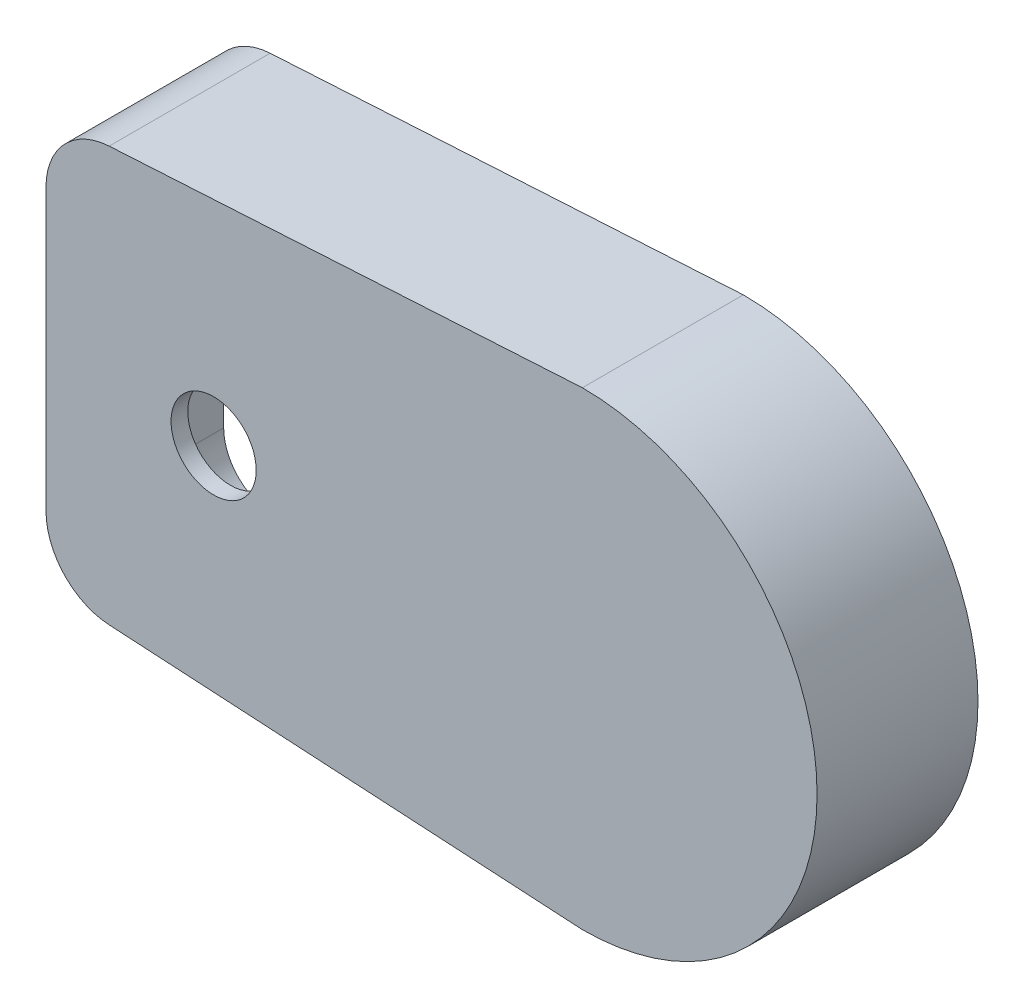
ISO-10303-21;
HEADER;
FILE_DESCRIPTION(('STEP AP214'),'2;1');
FILE_NAME('part.step','',(''),(''),'','','');
FILE_SCHEMA(('AUTOMOTIVE_DESIGN { 1 0 10303 214 1 1 1 1 }'));
ENDSEC;
DATA;
#1=APPLICATION_CONTEXT('core data for automotive mechanical design processes');
#2=APPLICATION_PROTOCOL_DEFINITION('international standard','automotive_design',2000,#1);
#3=PRODUCT_CONTEXT('',#1,'mechanical');
#4=PRODUCT('Part','Part','',(#3));
#5=PRODUCT_RELATED_PRODUCT_CATEGORY('part','',(#4));
#6=PRODUCT_DEFINITION_FORMATION('','',#4);
#7=PRODUCT_DEFINITION_CONTEXT('part definition',#1,'design');
#8=PRODUCT_DEFINITION('design','',#6,#7);
#9=PRODUCT_DEFINITION_SHAPE('','',#8);
#10=(LENGTH_UNIT() NAMED_UNIT(*) SI_UNIT(.MILLI.,.METRE.));
#11=(NAMED_UNIT(*) PLANE_ANGLE_UNIT() SI_UNIT($,.RADIAN.));
#12=(NAMED_UNIT(*) SI_UNIT($,.STERADIAN.) SOLID_ANGLE_UNIT());
#13=UNCERTAINTY_MEASURE_WITH_UNIT(LENGTH_MEASURE(1.E-05),#10,'distance_accuracy_value','');
#14=(GEOMETRIC_REPRESENTATION_CONTEXT(3) GLOBAL_UNCERTAINTY_ASSIGNED_CONTEXT((#13)) GLOBAL_UNIT_ASSIGNED_CONTEXT((#10,
#11,#12)) REPRESENTATION_CONTEXT('',''));
#15=CARTESIAN_POINT('',(0.,0.,0.));
#16=DIRECTION('',(0.,0.,1.));
#17=DIRECTION('',(1.,0.,0.));
#18=AXIS2_PLACEMENT_3D('',#15,#16,#17);
#19=CARTESIAN_POINT('',(20.,41.8728550290396,24.));
#20=DIRECTION('',(0.,0.,-1.));
#21=DIRECTION('',(-1.,0.,0.));
#22=AXIS2_PLACEMENT_3D('',#19,#20,#21);
#23=CYLINDRICAL_SURFACE('',#22,20.);
#24=CARTESIAN_POINT('',(20.,41.8728550290396,-24.));
#25=DIRECTION('',(0.,0.,1.));
#26=DIRECTION('',(1.,0.,0.));
#27=AXIS2_PLACEMENT_3D('',#24,#25,#26);
#28=CIRCLE('',#27,20.);
#29=CARTESIAN_POINT('',(18.8456774284378,61.8395157263316,-24.));
#30=VERTEX_POINT('',#29);
#31=CARTESIAN_POINT('',(0.,41.8728550290396,-24.));
#32=VERTEX_POINT('',#31);
#33=EDGE_CURVE('E139',#30,#32,#28,.T.);
#34=ORIENTED_EDGE('',*,*,#33,.T.);
#35=DIRECTION('',(0.,0.,-1.));
#36=VECTOR('',#35,1.);
#37=CARTESIAN_POINT('',(0.,41.8728550290396,24.));
#38=LINE('',#37,#36);
#39=CARTESIAN_POINT('',(0.,41.8728550290396,24.));
#40=VERTEX_POINT('',#39);
#41=EDGE_CURVE('E11',#40,#32,#38,.T.);
#42=ORIENTED_EDGE('',*,*,#41,.F.);
#43=CARTESIAN_POINT('',(20.,41.8728550290396,24.));
#44=DIRECTION('',(0.,0.,1.));
#45=DIRECTION('',(1.,0.,0.));
#46=AXIS2_PLACEMENT_3D('',#43,#44,#45);
#47=CIRCLE('',#46,20.);
#48=CARTESIAN_POINT('',(18.8456774284378,61.8395157263316,24.));
#49=VERTEX_POINT('',#48);
#50=EDGE_CURVE('E154',#49,#40,#47,.T.);
#51=ORIENTED_EDGE('',*,*,#50,.F.);
#52=DIRECTION('',(0.,0.,-1.));
#53=VECTOR('',#52,1.);
#54=CARTESIAN_POINT('',(18.8456774284378,61.8395157263316,24.));
#55=LINE('',#54,#53);
#56=EDGE_CURVE('E65',#49,#30,#55,.T.);
#57=ORIENTED_EDGE('',*,*,#56,.T.);
#58=EDGE_LOOP('',(#34,#42,#51,#57));
#59=FACE_BOUND('',#58,.T.);
#60=ADVANCED_FACE('F41',(#59),#23,.T.);
#61=CARTESIAN_POINT('',(0.,41.8728550290396,24.));
#62=DIRECTION('',(1.,0.,0.));
#63=DIRECTION('',(0.,1.,0.));
#64=AXIS2_PLACEMENT_3D('',#61,#62,#63);
#65=PLANE('',#64);
#66=DIRECTION('',(0.,-1.,0.));
#67=VECTOR('',#66,1.);
#68=CARTESIAN_POINT('',(0.,41.8728550290396,-24.));
#69=LINE('',#68,#67);
#70=CARTESIAN_POINT('',(0.,-41.8728550290396,-24.));
#71=VERTEX_POINT('',#70);
#72=EDGE_CURVE('E141',#32,#71,#69,.T.);
#73=ORIENTED_EDGE('',*,*,#72,.T.);
#74=DIRECTION('',(0.,0.,-1.));
#75=VECTOR('',#74,1.);
#76=CARTESIAN_POINT('',(0.,-41.8728550290396,24.));
#77=LINE('',#76,#75);
#78=CARTESIAN_POINT('',(0.,-41.8728550290396,24.));
#79=VERTEX_POINT('',#78);
#80=EDGE_CURVE('E49',#79,#71,#77,.T.);
#81=ORIENTED_EDGE('',*,*,#80,.F.);
#82=DIRECTION('',(0.,-1.,0.));
#83=VECTOR('',#82,1.);
#84=CARTESIAN_POINT('',(0.,41.8728550290396,24.));
#85=LINE('',#84,#83);
#86=EDGE_CURVE('E98',#40,#79,#85,.T.);
#87=ORIENTED_EDGE('',*,*,#86,.F.);
#88=ORIENTED_EDGE('',*,*,#41,.T.);
#89=EDGE_LOOP('',(#73,#81,#87,#88));
#90=FACE_BOUND('',#89,.T.);
#91=ADVANCED_FACE('F161',(#90),#65,.F.);
#92=CARTESIAN_POINT('',(20.,-41.8728550290396,24.));
#93=DIRECTION('',(0.,0.,-1.));
#94=DIRECTION('',(-1.,0.,0.));
#95=AXIS2_PLACEMENT_3D('',#92,#93,#94);
#96=CYLINDRICAL_SURFACE('',#95,20.);
#97=CARTESIAN_POINT('',(20.,-41.8728550290396,-24.));
#98=DIRECTION('',(0.,0.,-1.));
#99=DIRECTION('',(-1.,0.,0.));
#100=AXIS2_PLACEMENT_3D('',#97,#98,#99);
#101=CIRCLE('',#100,20.);
#102=CARTESIAN_POINT('',(18.8456774284378,-61.8395157263316,-24.));
#103=VERTEX_POINT('',#102);
#104=EDGE_CURVE('E145',#103,#71,#101,.T.);
#105=ORIENTED_EDGE('',*,*,#104,.F.);
#106=DIRECTION('',(0.,0.,-1.));
#107=VECTOR('',#106,1.);
#108=CARTESIAN_POINT('',(18.8456774284378,-61.8395157263316,24.));
#109=LINE('',#108,#107);
#110=CARTESIAN_POINT('',(18.8456774284378,-61.8395157263316,24.));
#111=VERTEX_POINT('',#110);
#112=EDGE_CURVE('E130',#111,#103,#109,.T.);
#113=ORIENTED_EDGE('',*,*,#112,.F.);
#114=CARTESIAN_POINT('',(20.,-41.8728550290396,24.));
#115=DIRECTION('',(0.,0.,-1.));
#116=DIRECTION('',(-1.,0.,0.));
#117=AXIS2_PLACEMENT_3D('',#114,#115,#116);
#118=CIRCLE('',#117,20.);
#119=EDGE_CURVE('E119',#111,#79,#118,.T.);
#120=ORIENTED_EDGE('',*,*,#119,.T.);
#121=ORIENTED_EDGE('',*,*,#80,.T.);
#122=EDGE_LOOP('',(#105,#113,#120,#121));
#123=FACE_BOUND('',#122,.T.);
#124=ADVANCED_FACE('F160',(#123),#96,.T.);
#125=CARTESIAN_POINT('',(18.8456774284378,-61.8395157263316,24.));
#126=DIRECTION('',(0.0577161285781096,0.998333034864596,0.));
#127=DIRECTION('',(-0.998333034864596,0.0577161285781096,0.));
#128=AXIS2_PLACEMENT_3D('',#125,#126,#127);
#129=PLANE('',#128);
#130=DIRECTION('',(0.998333034864596,-0.0577161285781096,0.));
#131=VECTOR('',#130,1.);
#132=CARTESIAN_POINT('',(18.8456774284378,-61.8395157263316,-24.));
#133=LINE('',#132,#131);
#134=CARTESIAN_POINT('',(160.,-70.,-24.));
#135=VERTEX_POINT('',#134);
#136=EDGE_CURVE('E126',#103,#135,#133,.T.);
#137=ORIENTED_EDGE('',*,*,#136,.T.);
#138=DIRECTION('',(0.,0.,-1.));
#139=VECTOR('',#138,1.);
#140=CARTESIAN_POINT('',(160.,-70.,24.));
#141=LINE('',#140,#139);
#142=CARTESIAN_POINT('',(160.,-70.,24.));
#143=VERTEX_POINT('',#142);
#144=EDGE_CURVE('E123',#143,#135,#141,.T.);
#145=ORIENTED_EDGE('',*,*,#144,.F.);
#146=DIRECTION('',(0.998333034864596,-0.0577161285781096,0.));
#147=VECTOR('',#146,1.);
#148=CARTESIAN_POINT('',(18.8456774284378,-61.8395157263316,24.));
#149=LINE('',#148,#147);
#150=EDGE_CURVE('E111',#111,#143,#149,.T.);
#151=ORIENTED_EDGE('',*,*,#150,.F.);
#152=ORIENTED_EDGE('',*,*,#112,.T.);
#153=EDGE_LOOP('',(#137,#145,#151,#152));
#154=FACE_BOUND('',#153,.T.);
#155=ADVANCED_FACE('F124',(#154),#129,.F.);
#156=CARTESIAN_POINT('',(160.,0.,24.));
#157=DIRECTION('',(0.,0.,-1.));
#158=DIRECTION('',(-1.,0.,0.));
#159=AXIS2_PLACEMENT_3D('',#156,#157,#158);
#160=CYLINDRICAL_SURFACE('',#159,70.);
#161=CARTESIAN_POINT('',(160.,0.,-24.));
#162=DIRECTION('',(0.,0.,1.));
#163=DIRECTION('',(1.,0.,0.));
#164=AXIS2_PLACEMENT_3D('',#161,#162,#163);
#165=CIRCLE('',#164,70.);
#166=CARTESIAN_POINT('',(160.,70.,-24.));
#167=VERTEX_POINT('',#166);
#168=EDGE_CURVE('E149',#135,#167,#165,.T.);
#169=ORIENTED_EDGE('',*,*,#168,.T.);
#170=DIRECTION('',(0.,0.,-1.));
#171=VECTOR('',#170,1.);
#172=CARTESIAN_POINT('',(160.,70.,24.));
#173=LINE('',#172,#171);
#174=CARTESIAN_POINT('',(160.,70.,24.));
#175=VERTEX_POINT('',#174);
#176=EDGE_CURVE('E131',#175,#167,#173,.T.);
#177=ORIENTED_EDGE('',*,*,#176,.F.);
#178=CARTESIAN_POINT('',(160.,0.,24.));
#179=DIRECTION('',(0.,0.,1.));
#180=DIRECTION('',(1.,0.,0.));
#181=AXIS2_PLACEMENT_3D('',#178,#179,#180);
#182=CIRCLE('',#181,70.);
#183=EDGE_CURVE('E116',#143,#175,#182,.T.);
#184=ORIENTED_EDGE('',*,*,#183,.F.);
#185=ORIENTED_EDGE('',*,*,#144,.T.);
#186=EDGE_LOOP('',(#169,#177,#184,#185));
#187=FACE_BOUND('',#186,.T.);
#188=ADVANCED_FACE('F133',(#187),#160,.T.);
#189=CARTESIAN_POINT('',(18.8456774284378,61.8395157263316,24.));
#190=DIRECTION('',(-0.0577161285781096,0.998333034864596,0.));
#191=DIRECTION('',(-0.998333034864596,-0.0577161285781096,0.));
#192=AXIS2_PLACEMENT_3D('',#189,#190,#191);
#193=PLANE('',#192);
#194=DIRECTION('',(0.998333034864596,0.0577161285781096,0.));
#195=VECTOR('',#194,1.);
#196=CARTESIAN_POINT('',(18.8456774284378,61.8395157263316,-24.));
#197=LINE('',#196,#195);
#198=EDGE_CURVE('E151',#30,#167,#197,.T.);
#199=ORIENTED_EDGE('',*,*,#198,.F.);
#200=ORIENTED_EDGE('',*,*,#56,.F.);
#201=DIRECTION('',(0.998333034864596,0.0577161285781096,0.));
#202=VECTOR('',#201,1.);
#203=CARTESIAN_POINT('',(18.8456774284378,61.8395157263316,24.));
#204=LINE('',#203,#202);
#205=EDGE_CURVE('E134',#49,#175,#204,.T.);
#206=ORIENTED_EDGE('',*,*,#205,.T.);
#207=ORIENTED_EDGE('',*,*,#176,.T.);
#208=EDGE_LOOP('',(#199,#200,#206,#207));
#209=FACE_BOUND('',#208,.T.);
#210=ADVANCED_FACE('F165',(#209),#193,.T.);
#211=CARTESIAN_POINT('',(20.,41.8728550290396,24.));
#212=DIRECTION('',(0.,0.,1.));
#213=DIRECTION('',(1.,0.,0.));
#214=AXIS2_PLACEMENT_3D('',#211,#212,#213);
#215=PLANE('',#214);
#216=CARTESIAN_POINT('',(50.,0.,24.));
#217=DIRECTION('',(0.,0.,1.));
#218=DIRECTION('',(1.,0.,0.));
#219=AXIS2_PLACEMENT_3D('',#216,#217,#218);
#220=CIRCLE('',#219,12.7);
#221=CARTESIAN_POINT('',(62.7,0.,24.));
#222=VERTEX_POINT('',#221);
#223=EDGE_CURVE('E225',#222,#222,#220,.T.);
#224=ORIENTED_EDGE('',*,*,#223,.F.);
#225=EDGE_LOOP('',(#224));
#226=FACE_BOUND('',#225,.T.);
#227=ORIENTED_EDGE('',*,*,#50,.T.);
#228=ORIENTED_EDGE('',*,*,#86,.T.);
#229=ORIENTED_EDGE('',*,*,#119,.F.);
#230=ORIENTED_EDGE('',*,*,#150,.T.);
#231=ORIENTED_EDGE('',*,*,#183,.T.);
#232=ORIENTED_EDGE('',*,*,#205,.F.);
#233=EDGE_LOOP('',(#227,#228,#229,#230,#231,#232));
#234=FACE_BOUND('',#233,.T.);
#235=ADVANCED_FACE('F113',(#226,#234),#215,.T.);
#236=CARTESIAN_POINT('',(20.,41.8728550290396,-24.));
#237=DIRECTION('',(0.,0.,1.));
#238=DIRECTION('',(1.,0.,0.));
#239=AXIS2_PLACEMENT_3D('',#236,#237,#238);
#240=PLANE('',#239);
#241=DIRECTION('',(0.998333034864596,0.0577161285781096,0.));
#242=VECTOR('',#241,1.);
#243=CARTESIAN_POINT('',(19.1342580713284,56.8478505520086,-24.));
#244=LINE('',#243,#242);
#245=CARTESIAN_POINT('',(19.1342580713284,56.8478505520086,-24.));
#246=VERTEX_POINT('',#245);
#247=CARTESIAN_POINT('',(160.141737642964,64.9998454647438,-24.));
#248=VERTEX_POINT('',#247);
#249=EDGE_CURVE('E249',#246,#248,#244,.T.);
#250=ORIENTED_EDGE('',*,*,#249,.F.);
#251=CARTESIAN_POINT('',(20.,41.8728550290396,-24.));
#252=DIRECTION('',(0.,0.,-1.));
#253=DIRECTION('',(-1.,0.,0.));
#254=AXIS2_PLACEMENT_3D('',#251,#252,#253);
#255=CIRCLE('',#254,15.);
#256=CARTESIAN_POINT('',(5.,41.8728550290396,-24.));
#257=VERTEX_POINT('',#256);
#258=EDGE_CURVE('E56',#257,#246,#255,.T.);
#259=ORIENTED_EDGE('',*,*,#258,.F.);
#260=DIRECTION('',(0.,1.,0.));
#261=VECTOR('',#260,1.);
#262=CARTESIAN_POINT('',(5.00000000000001,-41.8728550290396,-24.));
#263=LINE('',#262,#261);
#264=CARTESIAN_POINT('',(5.00000000000001,-41.8728550290396,-24.));
#265=VERTEX_POINT('',#264);
#266=EDGE_CURVE('E232',#265,#257,#263,.T.);
#267=ORIENTED_EDGE('',*,*,#266,.F.);
#268=CARTESIAN_POINT('',(20.,-41.8728550290396,-24.));
#269=DIRECTION('',(0.,0.,-1.));
#270=DIRECTION('',(-1.,0.,0.));
#271=AXIS2_PLACEMENT_3D('',#268,#269,#270);
#272=CIRCLE('',#271,15.);
#273=CARTESIAN_POINT('',(19.1342580713284,-56.8478505520086,-24.));
#274=VERTEX_POINT('',#273);
#275=EDGE_CURVE('E258',#274,#265,#272,.T.);
#276=ORIENTED_EDGE('',*,*,#275,.F.);
#277=DIRECTION('',(-0.998333034864596,0.0577161285781096,0.));
#278=VECTOR('',#277,1.);
#279=CARTESIAN_POINT('',(160.141737642964,-64.9998454647438,-24.));
#280=LINE('',#279,#278);
#281=CARTESIAN_POINT('',(160.141737642964,-64.9998454647438,-24.));
#282=VERTEX_POINT('',#281);
#283=EDGE_CURVE('E255',#282,#274,#280,.T.);
#284=ORIENTED_EDGE('',*,*,#283,.F.);
#285=CARTESIAN_POINT('',(160.,0.,-24.));
#286=DIRECTION('',(0.,0.,-1.));
#287=DIRECTION('',(-1.,0.,0.));
#288=AXIS2_PLACEMENT_3D('',#285,#286,#287);
#289=CIRCLE('',#288,65.);
#290=EDGE_CURVE('E252',#248,#282,#289,.T.);
#291=ORIENTED_EDGE('',*,*,#290,.F.);
#292=EDGE_LOOP('',(#250,#259,#267,#276,#284,#291));
#293=FACE_BOUND('',#292,.T.);
#294=ORIENTED_EDGE('',*,*,#33,.F.);
#295=ORIENTED_EDGE('',*,*,#198,.T.);
#296=ORIENTED_EDGE('',*,*,#168,.F.);
#297=ORIENTED_EDGE('',*,*,#136,.F.);
#298=ORIENTED_EDGE('',*,*,#104,.T.);
#299=ORIENTED_EDGE('',*,*,#72,.F.);
#300=EDGE_LOOP('',(#294,#295,#296,#297,#298,#299));
#301=FACE_BOUND('',#300,.T.);
#302=ADVANCED_FACE('F164',(#293,#301),#240,.F.);
#303=CARTESIAN_POINT('',(20.,41.8728550290396,19.));
#304=DIRECTION('',(0.,0.,-1.));
#305=DIRECTION('',(-1.,0.,0.));
#306=AXIS2_PLACEMENT_3D('',#303,#304,#305);
#307=CYLINDRICAL_SURFACE('',#306,15.);
#308=ORIENTED_EDGE('',*,*,#258,.T.);
#309=DIRECTION('',(0.,0.,-1.));
#310=VECTOR('',#309,1.);
#311=CARTESIAN_POINT('',(19.1342580713284,56.8478505520086,19.));
#312=LINE('',#311,#310);
#313=CARTESIAN_POINT('',(19.1342580713284,56.8478505520086,19.));
#314=VERTEX_POINT('',#313);
#315=EDGE_CURVE('E247',#314,#246,#312,.T.);
#316=ORIENTED_EDGE('',*,*,#315,.F.);
#317=CARTESIAN_POINT('',(20.,41.8728550290396,19.));
#318=DIRECTION('',(0.,0.,-1.));
#319=DIRECTION('',(-1.,0.,0.));
#320=AXIS2_PLACEMENT_3D('',#317,#318,#319);
#321=CIRCLE('',#320,15.);
#322=CARTESIAN_POINT('',(5.,41.8728550290396,19.));
#323=VERTEX_POINT('',#322);
#324=EDGE_CURVE('E228',#323,#314,#321,.T.);
#325=ORIENTED_EDGE('',*,*,#324,.F.);
#326=DIRECTION('',(0.,0.,-1.));
#327=VECTOR('',#326,1.);
#328=CARTESIAN_POINT('',(5.,41.8728550290396,19.));
#329=LINE('',#328,#327);
#330=EDGE_CURVE('E142',#323,#257,#329,.T.);
#331=ORIENTED_EDGE('',*,*,#330,.T.);
#332=EDGE_LOOP('',(#308,#316,#325,#331));
#333=FACE_BOUND('',#332,.T.);
#334=ADVANCED_FACE('F184',(#333),#307,.F.);
#335=CARTESIAN_POINT('',(5.00000000000001,-41.8728550290396,19.));
#336=DIRECTION('',(-1.,0.,0.));
#337=DIRECTION('',(0.,-1.,0.));
#338=AXIS2_PLACEMENT_3D('',#335,#336,#337);
#339=PLANE('',#338);
#340=ORIENTED_EDGE('',*,*,#266,.T.);
#341=ORIENTED_EDGE('',*,*,#330,.F.);
#342=DIRECTION('',(0.,1.,0.));
#343=VECTOR('',#342,1.);
#344=CARTESIAN_POINT('',(5.00000000000001,-41.8728550290396,19.));
#345=LINE('',#344,#343);
#346=CARTESIAN_POINT('',(5.00000000000001,-41.8728550290396,19.));
#347=VERTEX_POINT('',#346);
#348=EDGE_CURVE('E244',#347,#323,#345,.T.);
#349=ORIENTED_EDGE('',*,*,#348,.F.);
#350=DIRECTION('',(0.,0.,-1.));
#351=VECTOR('',#350,1.);
#352=CARTESIAN_POINT('',(5.00000000000001,-41.8728550290396,19.));
#353=LINE('',#352,#351);
#354=EDGE_CURVE('E264',#347,#265,#353,.T.);
#355=ORIENTED_EDGE('',*,*,#354,.T.);
#356=EDGE_LOOP('',(#340,#341,#349,#355));
#357=FACE_BOUND('',#356,.T.);
#358=ADVANCED_FACE('F191',(#357),#339,.F.);
#359=CARTESIAN_POINT('',(20.,-41.8728550290396,19.));
#360=DIRECTION('',(0.,0.,-1.));
#361=DIRECTION('',(-1.,0.,0.));
#362=AXIS2_PLACEMENT_3D('',#359,#360,#361);
#363=CYLINDRICAL_SURFACE('',#362,15.);
#364=ORIENTED_EDGE('',*,*,#275,.T.);
#365=ORIENTED_EDGE('',*,*,#354,.F.);
#366=CARTESIAN_POINT('',(20.,-41.8728550290396,19.));
#367=DIRECTION('',(0.,0.,-1.));
#368=DIRECTION('',(-1.,0.,0.));
#369=AXIS2_PLACEMENT_3D('',#366,#367,#368);
#370=CIRCLE('',#369,15.);
#371=CARTESIAN_POINT('',(19.1342580713284,-56.8478505520086,19.));
#372=VERTEX_POINT('',#371);
#373=EDGE_CURVE('E241',#372,#347,#370,.T.);
#374=ORIENTED_EDGE('',*,*,#373,.F.);
#375=DIRECTION('',(0.,0.,-1.));
#376=VECTOR('',#375,1.);
#377=CARTESIAN_POINT('',(19.1342580713284,-56.8478505520086,19.));
#378=LINE('',#377,#376);
#379=EDGE_CURVE('E267',#372,#274,#378,.T.);
#380=ORIENTED_EDGE('',*,*,#379,.T.);
#381=EDGE_LOOP('',(#364,#365,#374,#380));
#382=FACE_BOUND('',#381,.T.);
#383=ADVANCED_FACE('F204',(#382),#363,.F.);
#384=CARTESIAN_POINT('',(160.141737642964,-64.9998454647438,19.));
#385=DIRECTION('',(-0.0577161285781096,-0.998333034864596,0.));
#386=DIRECTION('',(0.998333034864596,-0.0577161285781096,0.));
#387=AXIS2_PLACEMENT_3D('',#384,#385,#386);
#388=PLANE('',#387);
#389=ORIENTED_EDGE('',*,*,#283,.T.);
#390=ORIENTED_EDGE('',*,*,#379,.F.);
#391=DIRECTION('',(-0.998333034864596,0.0577161285781096,0.));
#392=VECTOR('',#391,1.);
#393=CARTESIAN_POINT('',(160.141737642964,-64.9998454647438,19.));
#394=LINE('',#393,#392);
#395=CARTESIAN_POINT('',(160.141737642964,-64.9998454647438,19.));
#396=VERTEX_POINT('',#395);
#397=EDGE_CURVE('E238',#396,#372,#394,.T.);
#398=ORIENTED_EDGE('',*,*,#397,.F.);
#399=DIRECTION('',(0.,0.,-1.));
#400=VECTOR('',#399,1.);
#401=CARTESIAN_POINT('',(160.141737642964,-64.9998454647438,19.));
#402=LINE('',#401,#400);
#403=EDGE_CURVE('E270',#396,#282,#402,.T.);
#404=ORIENTED_EDGE('',*,*,#403,.T.);
#405=EDGE_LOOP('',(#389,#390,#398,#404));
#406=FACE_BOUND('',#405,.T.);
#407=ADVANCED_FACE('F200',(#406),#388,.F.);
#408=CARTESIAN_POINT('',(160.,0.,19.));
#409=DIRECTION('',(0.,0.,-1.));
#410=DIRECTION('',(-1.,0.,0.));
#411=AXIS2_PLACEMENT_3D('',#408,#409,#410);
#412=CYLINDRICAL_SURFACE('',#411,65.);
#413=ORIENTED_EDGE('',*,*,#290,.T.);
#414=ORIENTED_EDGE('',*,*,#403,.F.);
#415=CARTESIAN_POINT('',(160.,0.,19.));
#416=DIRECTION('',(0.,0.,-1.));
#417=DIRECTION('',(-1.,0.,0.));
#418=AXIS2_PLACEMENT_3D('',#415,#416,#417);
#419=CIRCLE('',#418,65.);
#420=CARTESIAN_POINT('',(160.141737642964,64.9998454647438,19.));
#421=VERTEX_POINT('',#420);
#422=EDGE_CURVE('E235',#421,#396,#419,.T.);
#423=ORIENTED_EDGE('',*,*,#422,.F.);
#424=DIRECTION('',(0.,0.,-1.));
#425=VECTOR('',#424,1.);
#426=CARTESIAN_POINT('',(160.141737642964,64.9998454647438,19.));
#427=LINE('',#426,#425);
#428=EDGE_CURVE('E273',#421,#248,#427,.T.);
#429=ORIENTED_EDGE('',*,*,#428,.T.);
#430=EDGE_LOOP('',(#413,#414,#423,#429));
#431=FACE_BOUND('',#430,.T.);
#432=ADVANCED_FACE('F196',(#431),#412,.F.);
#433=CARTESIAN_POINT('',(19.1342580713284,56.8478505520086,19.));
#434=DIRECTION('',(-0.0577161285781096,0.998333034864596,0.));
#435=DIRECTION('',(-0.998333034864596,-0.0577161285781096,0.));
#436=AXIS2_PLACEMENT_3D('',#433,#434,#435);
#437=PLANE('',#436);
#438=ORIENTED_EDGE('',*,*,#249,.T.);
#439=ORIENTED_EDGE('',*,*,#428,.F.);
#440=DIRECTION('',(0.998333034864596,0.0577161285781096,0.));
#441=VECTOR('',#440,1.);
#442=CARTESIAN_POINT('',(19.1342580713284,56.8478505520086,19.));
#443=LINE('',#442,#441);
#444=EDGE_CURVE('E231',#314,#421,#443,.T.);
#445=ORIENTED_EDGE('',*,*,#444,.F.);
#446=ORIENTED_EDGE('',*,*,#315,.T.);
#447=EDGE_LOOP('',(#438,#439,#445,#446));
#448=FACE_BOUND('',#447,.T.);
#449=ADVANCED_FACE('F192',(#448),#437,.F.);
#450=CARTESIAN_POINT('',(20.,41.8728550290396,19.));
#451=DIRECTION('',(0.,0.,-1.));
#452=DIRECTION('',(-1.,0.,0.));
#453=AXIS2_PLACEMENT_3D('',#450,#451,#452);
#454=PLANE('',#453);
#455=CARTESIAN_POINT('',(50.,0.,19.));
#456=DIRECTION('',(0.,0.,-1.));
#457=DIRECTION('',(-1.,0.,0.));
#458=AXIS2_PLACEMENT_3D('',#455,#456,#457);
#459=CIRCLE('',#458,12.7);
#460=CARTESIAN_POINT('',(37.3,0.,19.));
#461=VERTEX_POINT('',#460);
#462=EDGE_CURVE('E44',#461,#461,#459,.T.);
#463=ORIENTED_EDGE('',*,*,#462,.F.);
#464=EDGE_LOOP('',(#463));
#465=FACE_BOUND('',#464,.T.);
#466=ORIENTED_EDGE('',*,*,#324,.T.);
#467=ORIENTED_EDGE('',*,*,#444,.T.);
#468=ORIENTED_EDGE('',*,*,#422,.T.);
#469=ORIENTED_EDGE('',*,*,#397,.T.);
#470=ORIENTED_EDGE('',*,*,#373,.T.);
#471=ORIENTED_EDGE('',*,*,#348,.T.);
#472=EDGE_LOOP('',(#466,#467,#468,#469,#470,#471));
#473=FACE_BOUND('',#472,.T.);
#474=ADVANCED_FACE('F195',(#465,#473),#454,.T.);
#475=CARTESIAN_POINT('',(50.,0.,14.));
#476=DIRECTION('',(0.,0.,1.));
#477=DIRECTION('',(1.,0.,0.));
#478=AXIS2_PLACEMENT_3D('',#475,#476,#477);
#479=CYLINDRICAL_SURFACE('',#478,12.7);
#480=ORIENTED_EDGE('',*,*,#462,.T.);
#481=EDGE_LOOP('',(#480));
#482=FACE_BOUND('',#481,.T.);
#483=ORIENTED_EDGE('',*,*,#223,.T.);
#484=EDGE_LOOP('',(#483));
#485=FACE_BOUND('',#484,.T.);
#486=ADVANCED_FACE('F214',(#482,#485),#479,.F.);
#487=CLOSED_SHELL('',(#60,#91,#124,#155,#188,#210,#235,#302,#334,#358,#383,#407,#432,#449,#474,#486));
#488=MANIFOLD_SOLID_BREP('B2',#487);
#489=ADVANCED_BREP_SHAPE_REPRESENTATION('',(#18,#488),#14);
#490=SHAPE_DEFINITION_REPRESENTATION(#9,#489);
ENDSEC;
END-ISO-10303-21;
